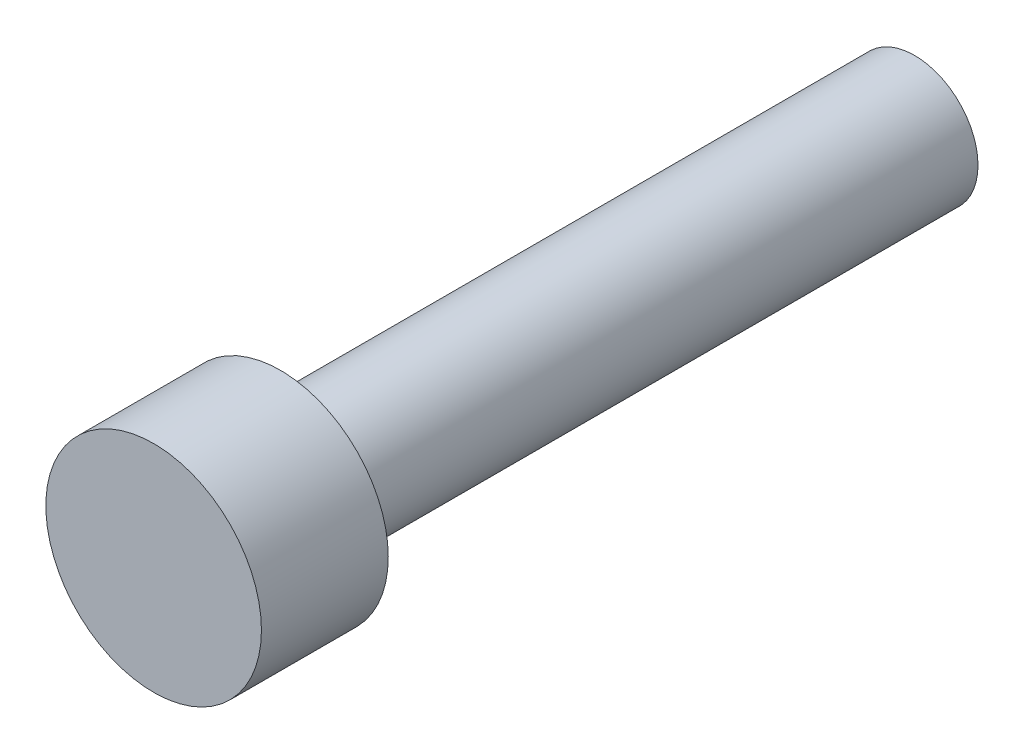
ISO-10303-21;
HEADER;
FILE_DESCRIPTION(('STEP AP214'),'2;1');
FILE_NAME('part.step','',(''),(''),'','','');
FILE_SCHEMA(('AUTOMOTIVE_DESIGN { 1 0 10303 214 1 1 1 1 }'));
ENDSEC;
DATA;
#1=APPLICATION_CONTEXT('core data for automotive mechanical design processes');
#2=APPLICATION_PROTOCOL_DEFINITION('international standard','automotive_design',2000,#1);
#3=PRODUCT_CONTEXT('',#1,'mechanical');
#4=PRODUCT('Part','Part','',(#3));
#5=PRODUCT_RELATED_PRODUCT_CATEGORY('part','',(#4));
#6=PRODUCT_DEFINITION_FORMATION('','',#4);
#7=PRODUCT_DEFINITION_CONTEXT('part definition',#1,'design');
#8=PRODUCT_DEFINITION('design','',#6,#7);
#9=PRODUCT_DEFINITION_SHAPE('','',#8);
#10=(LENGTH_UNIT() NAMED_UNIT(*) SI_UNIT(.MILLI.,.METRE.));
#11=(NAMED_UNIT(*) PLANE_ANGLE_UNIT() SI_UNIT($,.RADIAN.));
#12=(NAMED_UNIT(*) SI_UNIT($,.STERADIAN.) SOLID_ANGLE_UNIT());
#13=UNCERTAINTY_MEASURE_WITH_UNIT(LENGTH_MEASURE(1.E-05),#10,'distance_accuracy_value','');
#14=(GEOMETRIC_REPRESENTATION_CONTEXT(3) GLOBAL_UNCERTAINTY_ASSIGNED_CONTEXT((#13)) GLOBAL_UNIT_ASSIGNED_CONTEXT((#10,
#11,#12)) REPRESENTATION_CONTEXT('',''));
#15=CARTESIAN_POINT('',(0.,0.,0.));
#16=DIRECTION('',(0.,0.,1.));
#17=DIRECTION('',(1.,0.,0.));
#18=AXIS2_PLACEMENT_3D('',#15,#16,#17);
#19=CARTESIAN_POINT('',(0.,0.,-25.));
#20=DIRECTION('',(0.,0.,1.));
#21=DIRECTION('',(1.,0.,0.));
#22=AXIS2_PLACEMENT_3D('',#19,#20,#21);
#23=PLANE('',#22);
#24=CARTESIAN_POINT('',(0.,0.,-25.));
#25=DIRECTION('',(0.,0.,1.));
#26=DIRECTION('',(1.,0.,0.));
#27=AXIS2_PLACEMENT_3D('',#24,#25,#26);
#28=CIRCLE('',#27,2.5);
#29=CARTESIAN_POINT('',(2.5,0.,-25.));
#30=VERTEX_POINT('',#29);
#31=EDGE_CURVE('E10',#30,#30,#28,.T.);
#32=ORIENTED_EDGE('',*,*,#31,.F.);
#33=EDGE_LOOP('',(#32));
#34=FACE_BOUND('',#33,.T.);
#35=ADVANCED_FACE('F39',(#34),#23,.F.);
#36=CARTESIAN_POINT('',(0.,0.,10.));
#37=DIRECTION('',(0.,0.,1.));
#38=DIRECTION('',(1.,0.,0.));
#39=AXIS2_PLACEMENT_3D('',#36,#37,#38);
#40=CYLINDRICAL_SURFACE('',#39,2.5);
#41=CARTESIAN_POINT('',(0.,0.,0.));
#42=DIRECTION('',(0.,0.,1.));
#43=DIRECTION('',(1.,0.,0.));
#44=AXIS2_PLACEMENT_3D('',#41,#42,#43);
#45=CIRCLE('',#44,2.5);
#46=CARTESIAN_POINT('',(2.5,0.,0.));
#47=VERTEX_POINT('',#46);
#48=EDGE_CURVE('E45',#47,#47,#45,.T.);
#49=ORIENTED_EDGE('',*,*,#48,.F.);
#50=EDGE_LOOP('',(#49));
#51=FACE_BOUND('',#50,.T.);
#52=ORIENTED_EDGE('',*,*,#31,.T.);
#53=EDGE_LOOP('',(#52));
#54=FACE_BOUND('',#53,.T.);
#55=ADVANCED_FACE('F69',(#51,#54),#40,.T.);
#56=CARTESIAN_POINT('',(0.,2.5,0.));
#57=DIRECTION('',(0.,0.,1.));
#58=DIRECTION('',(1.,0.,0.));
#59=AXIS2_PLACEMENT_3D('',#56,#57,#58);
#60=PLANE('',#59);
#61=CARTESIAN_POINT('',(0.,0.,0.));
#62=DIRECTION('',(0.,0.,1.));
#63=DIRECTION('',(1.,0.,0.));
#64=AXIS2_PLACEMENT_3D('',#61,#62,#63);
#65=CIRCLE('',#64,4.25);
#66=CARTESIAN_POINT('',(4.25,0.,0.));
#67=VERTEX_POINT('',#66);
#68=EDGE_CURVE('E49',#67,#67,#65,.T.);
#69=ORIENTED_EDGE('',*,*,#68,.F.);
#70=EDGE_LOOP('',(#69));
#71=FACE_BOUND('',#70,.T.);
#72=ORIENTED_EDGE('',*,*,#48,.T.);
#73=EDGE_LOOP('',(#72));
#74=FACE_BOUND('',#73,.T.);
#75=ADVANCED_FACE('F64',(#71,#74),#60,.F.);
#76=CARTESIAN_POINT('',(0.,0.,10.));
#77=DIRECTION('',(0.,0.,1.));
#78=DIRECTION('',(1.,0.,0.));
#79=AXIS2_PLACEMENT_3D('',#76,#77,#78);
#80=CYLINDRICAL_SURFACE('',#79,4.25);
#81=CARTESIAN_POINT('',(0.,0.,5.));
#82=DIRECTION('',(0.,0.,1.));
#83=DIRECTION('',(1.,0.,0.));
#84=AXIS2_PLACEMENT_3D('',#81,#82,#83);
#85=CIRCLE('',#84,4.25);
#86=CARTESIAN_POINT('',(4.25,0.,5.));
#87=VERTEX_POINT('',#86);
#88=EDGE_CURVE('E53',#87,#87,#85,.T.);
#89=ORIENTED_EDGE('',*,*,#88,.F.);
#90=EDGE_LOOP('',(#89));
#91=FACE_BOUND('',#90,.T.);
#92=ORIENTED_EDGE('',*,*,#68,.T.);
#93=EDGE_LOOP('',(#92));
#94=FACE_BOUND('',#93,.T.);
#95=ADVANCED_FACE('F61',(#91,#94),#80,.T.);
#96=CARTESIAN_POINT('',(0.,4.25,5.));
#97=DIRECTION('',(0.,0.,-1.));
#98=DIRECTION('',(-1.,0.,0.));
#99=AXIS2_PLACEMENT_3D('',#96,#97,#98);
#100=PLANE('',#99);
#101=ORIENTED_EDGE('',*,*,#88,.T.);
#102=EDGE_LOOP('',(#101));
#103=FACE_BOUND('',#102,.T.);
#104=ADVANCED_FACE('F59',(#103),#100,.F.);
#105=CLOSED_SHELL('',(#35,#55,#75,#95,#104));
#106=MANIFOLD_SOLID_BREP('B2',#105);
#107=ADVANCED_BREP_SHAPE_REPRESENTATION('',(#18,#106),#14);
#108=SHAPE_DEFINITION_REPRESENTATION(#9,#107);
ENDSEC;
END-ISO-10303-21;
